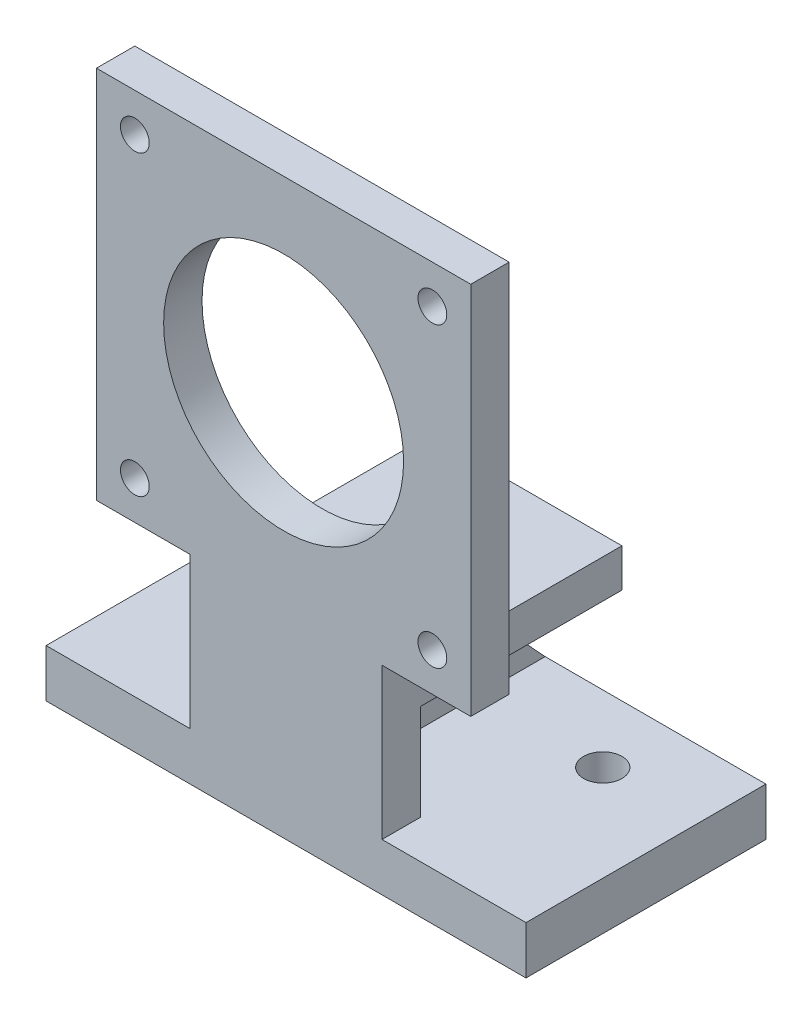
ISO-10303-21;
HEADER;
FILE_DESCRIPTION(('STEP AP214'),'2;1');
FILE_NAME('part.step','',(''),(''),'','','');
FILE_SCHEMA(('AUTOMOTIVE_DESIGN { 1 0 10303 214 1 1 1 1 }'));
ENDSEC;
DATA;
#1=APPLICATION_CONTEXT('core data for automotive mechanical design processes');
#2=APPLICATION_PROTOCOL_DEFINITION('international standard','automotive_design',2000,#1);
#3=PRODUCT_CONTEXT('',#1,'mechanical');
#4=PRODUCT('Part','Part','',(#3));
#5=PRODUCT_RELATED_PRODUCT_CATEGORY('part','',(#4));
#6=PRODUCT_DEFINITION_FORMATION('','',#4);
#7=PRODUCT_DEFINITION_CONTEXT('part definition',#1,'design');
#8=PRODUCT_DEFINITION('design','',#6,#7);
#9=PRODUCT_DEFINITION_SHAPE('','',#8);
#10=(LENGTH_UNIT() NAMED_UNIT(*) SI_UNIT(.MILLI.,.METRE.));
#11=(NAMED_UNIT(*) PLANE_ANGLE_UNIT() SI_UNIT($,.RADIAN.));
#12=(NAMED_UNIT(*) SI_UNIT($,.STERADIAN.) SOLID_ANGLE_UNIT());
#13=UNCERTAINTY_MEASURE_WITH_UNIT(LENGTH_MEASURE(1.E-05),#10,'distance_accuracy_value','');
#14=(GEOMETRIC_REPRESENTATION_CONTEXT(3) GLOBAL_UNCERTAINTY_ASSIGNED_CONTEXT((#13)) GLOBAL_UNIT_ASSIGNED_CONTEXT((#10,
#11,#12)) REPRESENTATION_CONTEXT('',''));
#15=CARTESIAN_POINT('',(0.,0.,0.));
#16=DIRECTION('',(0.,0.,1.));
#17=DIRECTION('',(1.,0.,0.));
#18=AXIS2_PLACEMENT_3D('',#15,#16,#17);
#19=CARTESIAN_POINT('',(0.,0.,0.));
#20=DIRECTION('',(0.,0.,1.));
#21=DIRECTION('',(1.,0.,0.));
#22=AXIS2_PLACEMENT_3D('',#19,#20,#21);
#23=PLANE('',#22);
#24=DIRECTION('',(-1.,0.,0.));
#25=VECTOR('',#24,1.);
#26=CARTESIAN_POINT('',(0.,-25.,0.));
#27=LINE('',#26,#25);
#28=CARTESIAN_POINT('',(10.,-25.,0.));
#29=VERTEX_POINT('',#28);
#30=CARTESIAN_POINT('',(2.,-25.,0.));
#31=VERTEX_POINT('',#30);
#32=EDGE_CURVE('E267',#29,#31,#27,.T.);
#33=ORIENTED_EDGE('',*,*,#32,.F.);
#34=DIRECTION('',(0.,-1.,0.));
#35=VECTOR('',#34,1.);
#36=CARTESIAN_POINT('',(10.,0.,0.));
#37=LINE('',#36,#35);
#38=CARTESIAN_POINT('',(10.,-35.,0.));
#39=VERTEX_POINT('',#38);
#40=EDGE_CURVE('E465',#29,#39,#37,.T.);
#41=ORIENTED_EDGE('',*,*,#40,.T.);
#42=DIRECTION('',(-1.,0.,0.));
#43=VECTOR('',#42,1.);
#44=CARTESIAN_POINT('',(0.,-35.,0.));
#45=LINE('',#44,#43);
#46=CARTESIAN_POINT('',(2.,-35.,0.));
#47=VERTEX_POINT('',#46);
#48=EDGE_CURVE('E393',#39,#47,#45,.T.);
#49=ORIENTED_EDGE('',*,*,#48,.T.);
#50=DIRECTION('',(0.,-1.,0.));
#51=VECTOR('',#50,1.);
#52=CARTESIAN_POINT('',(2.,0.,0.));
#53=LINE('',#52,#51);
#54=EDGE_CURVE('E319',#31,#47,#53,.T.);
#55=ORIENTED_EDGE('',*,*,#54,.F.);
#56=EDGE_LOOP('',(#33,#41,#49,#55));
#57=FACE_BOUND('',#56,.T.);
#58=ADVANCED_FACE('F116',(#57),#23,.F.);
#59=CARTESIAN_POINT('',(-2.,-25.,0.));
#60=VERTEX_POINT('',#59);
#61=CARTESIAN_POINT('',(-9.99999999999999,-25.,0.));
#62=VERTEX_POINT('',#61);
#63=EDGE_CURVE('E272',#60,#62,#27,.T.);
#64=ORIENTED_EDGE('',*,*,#63,.F.);
#65=DIRECTION('',(0.,-1.,0.));
#66=VECTOR('',#65,1.);
#67=CARTESIAN_POINT('',(-2.,0.,0.));
#68=LINE('',#67,#66);
#69=CARTESIAN_POINT('',(-2.,-35.,0.));
#70=VERTEX_POINT('',#69);
#71=EDGE_CURVE('E140',#60,#70,#68,.T.);
#72=ORIENTED_EDGE('',*,*,#71,.T.);
#73=CARTESIAN_POINT('',(-9.99999999999999,-35.,0.));
#74=VERTEX_POINT('',#73);
#75=EDGE_CURVE('E382',#70,#74,#45,.T.);
#76=ORIENTED_EDGE('',*,*,#75,.T.);
#77=DIRECTION('',(0.,-1.,0.));
#78=VECTOR('',#77,1.);
#79=CARTESIAN_POINT('',(-10.,0.,0.));
#80=LINE('',#79,#78);
#81=EDGE_CURVE('E490',#62,#74,#80,.T.);
#82=ORIENTED_EDGE('',*,*,#81,.F.);
#83=EDGE_LOOP('',(#64,#72,#76,#82));
#84=FACE_BOUND('',#83,.T.);
#85=ADVANCED_FACE('F588',(#84),#23,.F.);
#86=CARTESIAN_POINT('',(-0.252287314728645,0.223171224059343,0.));
#87=DIRECTION('',(0.,0.,1.));
#88=DIRECTION('',(1.,0.,0.));
#89=AXIS2_PLACEMENT_3D('',#86,#87,#88);
#90=CIRCLE('',#89,12.5);
#91=CARTESIAN_POINT('',(12.2477126852714,0.223171224059343,0.));
#92=VERTEX_POINT('',#91);
#93=EDGE_CURVE('E400',#92,#92,#90,.T.);
#94=ORIENTED_EDGE('',*,*,#93,.T.);
#95=EDGE_LOOP('',(#94));
#96=FACE_BOUND('',#95,.T.);
#97=CARTESIAN_POINT('',(-15.7522873147283,-15.2768287759407,0.));
#98=DIRECTION('',(0.,0.,1.));
#99=DIRECTION('',(1.,0.,0.));
#100=AXIS2_PLACEMENT_3D('',#97,#98,#99);
#101=CIRCLE('',#100,1.5);
#102=CARTESIAN_POINT('',(-14.2522873147283,-15.2768287759407,0.));
#103=VERTEX_POINT('',#102);
#104=EDGE_CURVE('E405',#103,#103,#101,.T.);
#105=ORIENTED_EDGE('',*,*,#104,.T.);
#106=EDGE_LOOP('',(#105));
#107=FACE_BOUND('',#106,.T.);
#108=CARTESIAN_POINT('',(-15.7522873147286,15.7231712240593,0.));
#109=DIRECTION('',(0.,0.,1.));
#110=DIRECTION('',(1.,0.,0.));
#111=AXIS2_PLACEMENT_3D('',#108,#109,#110);
#112=CIRCLE('',#111,1.5);
#113=CARTESIAN_POINT('',(-14.2522873147286,15.7231712240593,0.));
#114=VERTEX_POINT('',#113);
#115=EDGE_CURVE('E457',#114,#114,#112,.T.);
#116=ORIENTED_EDGE('',*,*,#115,.T.);
#117=EDGE_LOOP('',(#116));
#118=FACE_BOUND('',#117,.T.);
#119=CARTESIAN_POINT('',(15.2477126852717,-15.2768287759407,0.));
#120=DIRECTION('',(0.,0.,1.));
#121=DIRECTION('',(1.,0.,0.));
#122=AXIS2_PLACEMENT_3D('',#119,#120,#121);
#123=CIRCLE('',#122,1.5);
#124=CARTESIAN_POINT('',(16.7477126852717,-15.2768287759407,0.));
#125=VERTEX_POINT('',#124);
#126=EDGE_CURVE('E461',#125,#125,#123,.T.);
#127=ORIENTED_EDGE('',*,*,#126,.T.);
#128=EDGE_LOOP('',(#127));
#129=FACE_BOUND('',#128,.T.);
#130=CARTESIAN_POINT('',(15.2477126852714,15.7231712240593,0.));
#131=DIRECTION('',(0.,0.,1.));
#132=DIRECTION('',(1.,0.,0.));
#133=AXIS2_PLACEMENT_3D('',#130,#131,#132);
#134=CIRCLE('',#133,1.5);
#135=CARTESIAN_POINT('',(16.7477126852714,15.7231712240593,0.));
#136=VERTEX_POINT('',#135);
#137=EDGE_CURVE('E414',#136,#136,#134,.T.);
#138=ORIENTED_EDGE('',*,*,#137,.T.);
#139=EDGE_LOOP('',(#138));
#140=FACE_BOUND('',#139,.T.);
#141=DIRECTION('',(1.,0.,0.));
#142=VECTOR('',#141,1.);
#143=CARTESIAN_POINT('',(-21.,-21.,0.));
#144=LINE('',#143,#142);
#145=CARTESIAN_POINT('',(-9.99999999999999,-21.,0.));
#146=VERTEX_POINT('',#145);
#147=CARTESIAN_POINT('',(10.,-21.,0.));
#148=VERTEX_POINT('',#147);
#149=EDGE_CURVE('E308',#146,#148,#144,.T.);
#150=ORIENTED_EDGE('',*,*,#149,.F.);
#151=CARTESIAN_POINT('',(-9.99999999999999,-19.2768287759407,0.));
#152=VERTEX_POINT('',#151);
#153=EDGE_CURVE('E487',#152,#146,#80,.T.);
#154=ORIENTED_EDGE('',*,*,#153,.F.);
#155=DIRECTION('',(-1.,0.,0.));
#156=VECTOR('',#155,1.);
#157=CARTESIAN_POINT('',(0.,-19.2768287759407,0.));
#158=LINE('',#157,#156);
#159=CARTESIAN_POINT('',(-19.7522873147286,-19.2768287759407,0.));
#160=VERTEX_POINT('',#159);
#161=EDGE_CURVE('E475',#152,#160,#158,.T.);
#162=ORIENTED_EDGE('',*,*,#161,.T.);
#163=DIRECTION('',(0.,-1.,0.));
#164=VECTOR('',#163,1.);
#165=CARTESIAN_POINT('',(-19.7522873147286,0.,0.));
#166=LINE('',#165,#164);
#167=CARTESIAN_POINT('',(-19.7522873147286,19.7231712240593,0.));
#168=VERTEX_POINT('',#167);
#169=EDGE_CURVE('E483',#168,#160,#166,.T.);
#170=ORIENTED_EDGE('',*,*,#169,.F.);
#171=DIRECTION('',(-1.,0.,0.));
#172=VECTOR('',#171,1.);
#173=CARTESIAN_POINT('',(0.,19.7231712240593,0.));
#174=LINE('',#173,#172);
#175=CARTESIAN_POINT('',(19.2477126852714,19.7231712240593,0.));
#176=VERTEX_POINT('',#175);
#177=EDGE_CURVE('E479',#176,#168,#174,.T.);
#178=ORIENTED_EDGE('',*,*,#177,.F.);
#179=DIRECTION('',(0.,-1.,0.));
#180=VECTOR('',#179,1.);
#181=CARTESIAN_POINT('',(19.2477126852714,0.,0.));
#182=LINE('',#181,#180);
#183=CARTESIAN_POINT('',(19.2477126852714,-19.2768287759407,0.));
#184=VERTEX_POINT('',#183);
#185=EDGE_CURVE('E474',#176,#184,#182,.T.);
#186=ORIENTED_EDGE('',*,*,#185,.T.);
#187=CARTESIAN_POINT('',(10.,-19.2768287759407,0.));
#188=VERTEX_POINT('',#187);
#189=EDGE_CURVE('E470',#184,#188,#158,.T.);
#190=ORIENTED_EDGE('',*,*,#189,.T.);
#191=EDGE_CURVE('E466',#188,#148,#37,.T.);
#192=ORIENTED_EDGE('',*,*,#191,.T.);
#193=EDGE_LOOP('',(#150,#154,#162,#170,#178,#186,#190,#192));
#194=FACE_BOUND('',#193,.T.);
#195=ADVANCED_FACE('F573',(#96,#107,#118,#129,#140,#194),#23,.F.);
#196=CARTESIAN_POINT('',(-2.,-5.63619234872219,6.10572395330845));
#197=DIRECTION('',(0.,0.678289165188047,-0.734795079180926));
#198=DIRECTION('',(0.,0.734795079180926,0.678289165188047));
#199=AXIS2_PLACEMENT_3D('',#196,#197,#198);
#200=PLANE('',#199);
#201=DIRECTION('',(0.,0.734795079180926,0.678289165188047));
#202=VECTOR('',#201,1.);
#203=CARTESIAN_POINT('',(-2.,-5.63619234872219,6.10572395330845));
#204=LINE('',#203,#202);
#205=CARTESIAN_POINT('',(-2.,-35.,-21.));
#206=VERTEX_POINT('',#205);
#207=CARTESIAN_POINT('',(-2.,-25.,-11.769002346285));
#208=VERTEX_POINT('',#207);
#209=EDGE_CURVE('E324',#206,#208,#204,.T.);
#210=ORIENTED_EDGE('',*,*,#209,.T.);
#211=DIRECTION('',(1.,0.,0.));
#212=VECTOR('',#211,1.);
#213=CARTESIAN_POINT('',(-2.,-25.,-11.769002346285));
#214=LINE('',#213,#212);
#215=CARTESIAN_POINT('',(2.,-25.,-11.769002346285));
#216=VERTEX_POINT('',#215);
#217=EDGE_CURVE('E276',#208,#216,#214,.T.);
#218=ORIENTED_EDGE('',*,*,#217,.T.);
#219=DIRECTION('',(0.,0.734795079180926,0.678289165188047));
#220=VECTOR('',#219,1.);
#221=CARTESIAN_POINT('',(2.,-5.63619234872219,6.10572395330845));
#222=LINE('',#221,#220);
#223=CARTESIAN_POINT('',(2.,-35.,-21.));
#224=VERTEX_POINT('',#223);
#225=EDGE_CURVE('E315',#224,#216,#222,.T.);
#226=ORIENTED_EDGE('',*,*,#225,.F.);
#227=DIRECTION('',(1.,0.,0.));
#228=VECTOR('',#227,1.);
#229=CARTESIAN_POINT('',(-2.,-35.,-21.));
#230=LINE('',#229,#228);
#231=EDGE_CURVE('E330',#206,#224,#230,.T.);
#232=ORIENTED_EDGE('',*,*,#231,.F.);
#233=EDGE_LOOP('',(#210,#218,#226,#232));
#234=FACE_BOUND('',#233,.T.);
#235=ADVANCED_FACE('F584',(#234),#200,.T.);
#236=CARTESIAN_POINT('',(-2.,0.,0.));
#237=DIRECTION('',(1.,0.,0.));
#238=DIRECTION('',(0.,0.,-1.));
#239=AXIS2_PLACEMENT_3D('',#236,#237,#238);
#240=PLANE('',#239);
#241=DIRECTION('',(0.,0.,1.));
#242=VECTOR('',#241,1.);
#243=CARTESIAN_POINT('',(-2.,-25.,0.));
#244=LINE('',#243,#242);
#245=EDGE_CURVE('E305',#208,#60,#244,.T.);
#246=ORIENTED_EDGE('',*,*,#245,.F.);
#247=ORIENTED_EDGE('',*,*,#209,.F.);
#248=DIRECTION('',(0.,0.,-1.));
#249=VECTOR('',#248,1.);
#250=CARTESIAN_POINT('',(-2.,-35.,0.));
#251=LINE('',#250,#249);
#252=EDGE_CURVE('E132',#70,#206,#251,.T.);
#253=ORIENTED_EDGE('',*,*,#252,.F.);
#254=ORIENTED_EDGE('',*,*,#71,.F.);
#255=EDGE_LOOP('',(#246,#247,#253,#254));
#256=FACE_BOUND('',#255,.T.);
#257=ADVANCED_FACE('F587',(#256),#240,.F.);
#258=CARTESIAN_POINT('',(2.,0.,0.));
#259=DIRECTION('',(1.,0.,0.));
#260=DIRECTION('',(0.,0.,-1.));
#261=AXIS2_PLACEMENT_3D('',#258,#259,#260);
#262=PLANE('',#261);
#263=ORIENTED_EDGE('',*,*,#225,.T.);
#264=DIRECTION('',(0.,0.,1.));
#265=VECTOR('',#264,1.);
#266=CARTESIAN_POINT('',(2.,-25.,0.));
#267=LINE('',#266,#265);
#268=EDGE_CURVE('E12',#216,#31,#267,.T.);
#269=ORIENTED_EDGE('',*,*,#268,.T.);
#270=ORIENTED_EDGE('',*,*,#54,.T.);
#271=DIRECTION('',(0.,0.,-1.));
#272=VECTOR('',#271,1.);
#273=CARTESIAN_POINT('',(2.,-35.,0.));
#274=LINE('',#273,#272);
#275=EDGE_CURVE('E311',#47,#224,#274,.T.);
#276=ORIENTED_EDGE('',*,*,#275,.T.);
#277=EDGE_LOOP('',(#263,#269,#270,#276));
#278=FACE_BOUND('',#277,.T.);
#279=ADVANCED_FACE('F581',(#278),#262,.T.);
#280=CARTESIAN_POINT('',(0.,-35.,0.));
#281=DIRECTION('',(0.,1.,0.));
#282=DIRECTION('',(-1.,0.,0.));
#283=AXIS2_PLACEMENT_3D('',#280,#281,#282);
#284=PLANE('',#283);
#285=CARTESIAN_POINT('',(-15.,-35.,-14.));
#286=DIRECTION('',(0.,-1.,0.));
#287=DIRECTION('',(1.,0.,0.));
#288=AXIS2_PLACEMENT_3D('',#285,#286,#287);
#289=CIRCLE('',#288,2.);
#290=CARTESIAN_POINT('',(-13.,-35.,-14.));
#291=VERTEX_POINT('',#290);
#292=EDGE_CURVE('E342',#291,#291,#289,.T.);
#293=ORIENTED_EDGE('',*,*,#292,.T.);
#294=EDGE_LOOP('',(#293));
#295=FACE_BOUND('',#294,.T.);
#296=ORIENTED_EDGE('',*,*,#75,.F.);
#297=ORIENTED_EDGE('',*,*,#252,.T.);
#298=DIRECTION('',(1.,0.,0.));
#299=VECTOR('',#298,1.);
#300=CARTESIAN_POINT('',(25.,-35.,-21.));
#301=LINE('',#300,#299);
#302=CARTESIAN_POINT('',(-25.,-35.,-21.));
#303=VERTEX_POINT('',#302);
#304=EDGE_CURVE('E365',#303,#206,#301,.T.);
#305=ORIENTED_EDGE('',*,*,#304,.F.);
#306=DIRECTION('',(0.,0.,-1.));
#307=VECTOR('',#306,1.);
#308=CARTESIAN_POINT('',(-25.,-35.,3.99999999999999));
#309=LINE('',#308,#307);
#310=CARTESIAN_POINT('',(-25.,-35.,3.99999999999999));
#311=VERTEX_POINT('',#310);
#312=EDGE_CURVE('E360',#311,#303,#309,.T.);
#313=ORIENTED_EDGE('',*,*,#312,.F.);
#314=DIRECTION('',(-1.,0.,0.));
#315=VECTOR('',#314,1.);
#316=CARTESIAN_POINT('',(25.,-35.,3.99999999999999));
#317=LINE('',#316,#315);
#318=CARTESIAN_POINT('',(-9.99999999999999,-35.,3.99999999999999));
#319=VERTEX_POINT('',#318);
#320=EDGE_CURVE('E354',#319,#311,#317,.T.);
#321=ORIENTED_EDGE('',*,*,#320,.F.);
#322=DIRECTION('',(0.,0.,1.));
#323=VECTOR('',#322,1.);
#324=CARTESIAN_POINT('',(-9.99999999999999,-35.,4.));
#325=LINE('',#324,#323);
#326=EDGE_CURVE('E125',#74,#319,#325,.T.);
#327=ORIENTED_EDGE('',*,*,#326,.F.);
#328=EDGE_LOOP('',(#296,#297,#305,#313,#321,#327));
#329=FACE_BOUND('',#328,.T.);
#330=ADVANCED_FACE('F590',(#295,#329),#284,.T.);
#331=CARTESIAN_POINT('',(0.,0.,4.));
#332=DIRECTION('',(0.,0.,1.));
#333=DIRECTION('',(1.,0.,0.));
#334=AXIS2_PLACEMENT_3D('',#331,#332,#333);
#335=PLANE('',#334);
#336=DIRECTION('',(0.,-1.,0.));
#337=VECTOR('',#336,1.);
#338=CARTESIAN_POINT('',(-10.,0.,4.));
#339=LINE('',#338,#337);
#340=CARTESIAN_POINT('',(-9.99999999999999,-19.2768287759407,4.));
#341=VERTEX_POINT('',#340);
#342=EDGE_CURVE('E442',#341,#319,#339,.T.);
#343=ORIENTED_EDGE('',*,*,#342,.T.);
#344=ORIENTED_EDGE('',*,*,#320,.T.);
#345=DIRECTION('',(0.,-1.,0.));
#346=VECTOR('',#345,1.);
#347=CARTESIAN_POINT('',(-25.,-35.,3.99999999999999));
#348=LINE('',#347,#346);
#349=CARTESIAN_POINT('',(-25.,-40.,3.99999999999999));
#350=VERTEX_POINT('',#349);
#351=EDGE_CURVE('E386',#311,#350,#348,.T.);
#352=ORIENTED_EDGE('',*,*,#351,.T.);
#353=DIRECTION('',(1.,0.,0.));
#354=VECTOR('',#353,1.);
#355=CARTESIAN_POINT('',(0.,-40.,4.));
#356=LINE('',#355,#354);
#357=CARTESIAN_POINT('',(25.,-40.,3.99999999999999));
#358=VERTEX_POINT('',#357);
#359=EDGE_CURVE('E446',#350,#358,#356,.T.);
#360=ORIENTED_EDGE('',*,*,#359,.T.);
#361=DIRECTION('',(0.,-1.,0.));
#362=VECTOR('',#361,1.);
#363=CARTESIAN_POINT('',(25.,-35.,3.99999999999999));
#364=LINE('',#363,#362);
#365=CARTESIAN_POINT('',(25.,-35.,3.99999999999999));
#366=VERTEX_POINT('',#365);
#367=EDGE_CURVE('E368',#366,#358,#364,.T.);
#368=ORIENTED_EDGE('',*,*,#367,.F.);
#369=CARTESIAN_POINT('',(10.,-35.,3.99999999999999));
#370=VERTEX_POINT('',#369);
#371=EDGE_CURVE('E356',#366,#370,#317,.T.);
#372=ORIENTED_EDGE('',*,*,#371,.T.);
#373=DIRECTION('',(0.,-1.,0.));
#374=VECTOR('',#373,1.);
#375=CARTESIAN_POINT('',(10.,0.,4.));
#376=LINE('',#375,#374);
#377=CARTESIAN_POINT('',(10.,-19.2768287759407,4.));
#378=VERTEX_POINT('',#377);
#379=EDGE_CURVE('E422',#378,#370,#376,.T.);
#380=ORIENTED_EDGE('',*,*,#379,.F.);
#381=DIRECTION('',(-1.,0.,0.));
#382=VECTOR('',#381,1.);
#383=CARTESIAN_POINT('',(0.,-19.2768287759407,4.));
#384=LINE('',#383,#382);
#385=CARTESIAN_POINT('',(19.2477126852714,-19.2768287759407,4.));
#386=VERTEX_POINT('',#385);
#387=EDGE_CURVE('E426',#386,#378,#384,.T.);
#388=ORIENTED_EDGE('',*,*,#387,.F.);
#389=DIRECTION('',(0.,-1.,0.));
#390=VECTOR('',#389,1.);
#391=CARTESIAN_POINT('',(19.2477126852714,0.,4.));
#392=LINE('',#391,#390);
#393=CARTESIAN_POINT('',(19.2477126852714,19.7231712240593,4.));
#394=VERTEX_POINT('',#393);
#395=EDGE_CURVE('E430',#394,#386,#392,.T.);
#396=ORIENTED_EDGE('',*,*,#395,.F.);
#397=DIRECTION('',(-1.,0.,0.));
#398=VECTOR('',#397,1.);
#399=CARTESIAN_POINT('',(0.,19.7231712240593,4.));
#400=LINE('',#399,#398);
#401=CARTESIAN_POINT('',(-19.7522873147286,19.7231712240593,4.));
#402=VERTEX_POINT('',#401);
#403=EDGE_CURVE('E435',#394,#402,#400,.T.);
#404=ORIENTED_EDGE('',*,*,#403,.T.);
#405=DIRECTION('',(0.,-1.,0.));
#406=VECTOR('',#405,1.);
#407=CARTESIAN_POINT('',(-19.7522873147286,0.,4.));
#408=LINE('',#407,#406);
#409=CARTESIAN_POINT('',(-19.7522873147286,-19.2768287759407,4.));
#410=VERTEX_POINT('',#409);
#411=EDGE_CURVE('E439',#402,#410,#408,.T.);
#412=ORIENTED_EDGE('',*,*,#411,.T.);
#413=EDGE_CURVE('E431',#341,#410,#384,.T.);
#414=ORIENTED_EDGE('',*,*,#413,.F.);
#415=EDGE_LOOP('',(#343,#344,#352,#360,#368,#372,#380,#388,#396,#404,#412,#414));
#416=FACE_BOUND('',#415,.T.);
#417=CARTESIAN_POINT('',(15.2477126852714,15.7231712240593,4.));
#418=DIRECTION('',(0.,0.,1.));
#419=DIRECTION('',(1.,0.,0.));
#420=AXIS2_PLACEMENT_3D('',#417,#418,#419);
#421=CIRCLE('',#420,1.5);
#422=CARTESIAN_POINT('',(16.7477126852714,15.7231712240593,4.));
#423=VERTEX_POINT('',#422);
#424=EDGE_CURVE('E449',#423,#423,#421,.T.);
#425=ORIENTED_EDGE('',*,*,#424,.F.);
#426=EDGE_LOOP('',(#425));
#427=FACE_BOUND('',#426,.T.);
#428=CARTESIAN_POINT('',(15.2477126852717,-15.2768287759407,4.));
#429=DIRECTION('',(0.,0.,1.));
#430=DIRECTION('',(1.,0.,0.));
#431=AXIS2_PLACEMENT_3D('',#428,#429,#430);
#432=CIRCLE('',#431,1.5);
#433=CARTESIAN_POINT('',(16.7477126852717,-15.2768287759407,4.));
#434=VERTEX_POINT('',#433);
#435=EDGE_CURVE('E418',#434,#434,#432,.T.);
#436=ORIENTED_EDGE('',*,*,#435,.F.);
#437=EDGE_LOOP('',(#436));
#438=FACE_BOUND('',#437,.T.);
#439=CARTESIAN_POINT('',(-15.7522873147286,15.7231712240593,4.));
#440=DIRECTION('',(0.,0.,1.));
#441=DIRECTION('',(1.,0.,0.));
#442=AXIS2_PLACEMENT_3D('',#439,#440,#441);
#443=CIRCLE('',#442,1.5);
#444=CARTESIAN_POINT('',(-14.2522873147286,15.7231712240593,4.));
#445=VERTEX_POINT('',#444);
#446=EDGE_CURVE('E413',#445,#445,#443,.T.);
#447=ORIENTED_EDGE('',*,*,#446,.F.);
#448=EDGE_LOOP('',(#447));
#449=FACE_BOUND('',#448,.T.);
#450=CARTESIAN_POINT('',(-15.7522873147283,-15.2768287759407,4.));
#451=DIRECTION('',(0.,0.,1.));
#452=DIRECTION('',(1.,0.,0.));
#453=AXIS2_PLACEMENT_3D('',#450,#451,#452);
#454=CIRCLE('',#453,1.5);
#455=CARTESIAN_POINT('',(-14.2522873147283,-15.2768287759407,4.));
#456=VERTEX_POINT('',#455);
#457=EDGE_CURVE('E409',#456,#456,#454,.T.);
#458=ORIENTED_EDGE('',*,*,#457,.F.);
#459=EDGE_LOOP('',(#458));
#460=FACE_BOUND('',#459,.T.);
#461=CARTESIAN_POINT('',(-0.252287314728645,0.223171224059343,4.));
#462=DIRECTION('',(0.,0.,1.));
#463=DIRECTION('',(1.,0.,0.));
#464=AXIS2_PLACEMENT_3D('',#461,#462,#463);
#465=CIRCLE('',#464,12.5);
#466=CARTESIAN_POINT('',(12.2477126852714,0.223171224059343,4.));
#467=VERTEX_POINT('',#466);
#468=EDGE_CURVE('E401',#467,#467,#465,.T.);
#469=ORIENTED_EDGE('',*,*,#468,.F.);
#470=EDGE_LOOP('',(#469));
#471=FACE_BOUND('',#470,.T.);
#472=ADVANCED_FACE('F517',(#416,#427,#438,#449,#460,#471),#335,.T.);
#473=CARTESIAN_POINT('',(10.,0.,4.));
#474=DIRECTION('',(1.,0.,0.));
#475=DIRECTION('',(0.,1.,0.));
#476=AXIS2_PLACEMENT_3D('',#473,#474,#475);
#477=PLANE('',#476);
#478=DIRECTION('',(0.,0.,1.));
#479=VECTOR('',#478,1.);
#480=CARTESIAN_POINT('',(10.,-35.,4.));
#481=LINE('',#480,#479);
#482=EDGE_CURVE('E397',#39,#370,#481,.T.);
#483=ORIENTED_EDGE('',*,*,#482,.F.);
#484=ORIENTED_EDGE('',*,*,#40,.F.);
#485=DIRECTION('',(0.,0.,1.));
#486=VECTOR('',#485,1.);
#487=CARTESIAN_POINT('',(10.,-25.,-21.));
#488=LINE('',#487,#486);
#489=CARTESIAN_POINT('',(10.,-25.,-21.));
#490=VERTEX_POINT('',#489);
#491=EDGE_CURVE('E299',#490,#29,#488,.T.);
#492=ORIENTED_EDGE('',*,*,#491,.F.);
#493=DIRECTION('',(0.,-1.,0.));
#494=VECTOR('',#493,1.);
#495=CARTESIAN_POINT('',(10.,0.,-21.));
#496=LINE('',#495,#494);
#497=CARTESIAN_POINT('',(10.,-21.,-21.));
#498=VERTEX_POINT('',#497);
#499=EDGE_CURVE('E263',#498,#490,#496,.T.);
#500=ORIENTED_EDGE('',*,*,#499,.F.);
#501=DIRECTION('',(0.,0.,1.));
#502=VECTOR('',#501,1.);
#503=CARTESIAN_POINT('',(10.,-21.,-21.));
#504=LINE('',#503,#502);
#505=EDGE_CURVE('E295',#498,#148,#504,.T.);
#506=ORIENTED_EDGE('',*,*,#505,.T.);
#507=ORIENTED_EDGE('',*,*,#191,.F.);
#508=DIRECTION('',(0.,0.,-1.));
#509=VECTOR('',#508,1.);
#510=CARTESIAN_POINT('',(10.,-19.2768287759407,4.));
#511=LINE('',#510,#509);
#512=EDGE_CURVE('E509',#378,#188,#511,.T.);
#513=ORIENTED_EDGE('',*,*,#512,.F.);
#514=ORIENTED_EDGE('',*,*,#379,.T.);
#515=EDGE_LOOP('',(#483,#484,#492,#500,#506,#507,#513,#514));
#516=FACE_BOUND('',#515,.T.);
#517=ADVANCED_FACE('F552',(#516),#477,.T.);
#518=CARTESIAN_POINT('',(0.,-19.2768287759407,4.));
#519=DIRECTION('',(0.,-1.,0.));
#520=DIRECTION('',(1.,0.,0.));
#521=AXIS2_PLACEMENT_3D('',#518,#519,#520);
#522=PLANE('',#521);
#523=ORIENTED_EDGE('',*,*,#189,.F.);
#524=DIRECTION('',(0.,0.,-1.));
#525=VECTOR('',#524,1.);
#526=CARTESIAN_POINT('',(19.2477126852714,-19.2768287759407,4.));
#527=LINE('',#526,#525);
#528=EDGE_CURVE('E506',#386,#184,#527,.T.);
#529=ORIENTED_EDGE('',*,*,#528,.F.);
#530=ORIENTED_EDGE('',*,*,#387,.T.);
#531=ORIENTED_EDGE('',*,*,#512,.T.);
#532=EDGE_LOOP('',(#523,#529,#530,#531));
#533=FACE_BOUND('',#532,.T.);
#534=ADVANCED_FACE('F557',(#533),#522,.T.);
#535=CARTESIAN_POINT('',(19.2477126852714,0.,4.));
#536=DIRECTION('',(1.,0.,0.));
#537=DIRECTION('',(0.,0.,-1.));
#538=AXIS2_PLACEMENT_3D('',#535,#536,#537);
#539=PLANE('',#538);
#540=ORIENTED_EDGE('',*,*,#185,.F.);
#541=DIRECTION('',(0.,0.,-1.));
#542=VECTOR('',#541,1.);
#543=CARTESIAN_POINT('',(19.2477126852714,19.7231712240593,4.));
#544=LINE('',#543,#542);
#545=EDGE_CURVE('E503',#394,#176,#544,.T.);
#546=ORIENTED_EDGE('',*,*,#545,.F.);
#547=ORIENTED_EDGE('',*,*,#395,.T.);
#548=ORIENTED_EDGE('',*,*,#528,.T.);
#549=EDGE_LOOP('',(#540,#546,#547,#548));
#550=FACE_BOUND('',#549,.T.);
#551=ADVANCED_FACE('F561',(#550),#539,.T.);
#552=CARTESIAN_POINT('',(0.,19.7231712240593,4.));
#553=DIRECTION('',(0.,-1.,0.));
#554=DIRECTION('',(0.,0.,-1.));
#555=AXIS2_PLACEMENT_3D('',#552,#553,#554);
#556=PLANE('',#555);
#557=ORIENTED_EDGE('',*,*,#177,.T.);
#558=DIRECTION('',(0.,0.,-1.));
#559=VECTOR('',#558,1.);
#560=CARTESIAN_POINT('',(-19.7522873147286,19.7231712240593,4.));
#561=LINE('',#560,#559);
#562=EDGE_CURVE('E499',#402,#168,#561,.T.);
#563=ORIENTED_EDGE('',*,*,#562,.F.);
#564=ORIENTED_EDGE('',*,*,#403,.F.);
#565=ORIENTED_EDGE('',*,*,#545,.T.);
#566=EDGE_LOOP('',(#557,#563,#564,#565));
#567=FACE_BOUND('',#566,.T.);
#568=ADVANCED_FACE('F566',(#567),#556,.F.);
#569=CARTESIAN_POINT('',(-19.7522873147286,0.,4.));
#570=DIRECTION('',(1.,0.,0.));
#571=DIRECTION('',(0.,1.,0.));
#572=AXIS2_PLACEMENT_3D('',#569,#570,#571);
#573=PLANE('',#572);
#574=ORIENTED_EDGE('',*,*,#169,.T.);
#575=DIRECTION('',(0.,0.,-1.));
#576=VECTOR('',#575,1.);
#577=CARTESIAN_POINT('',(-19.7522873147286,-19.2768287759407,4.));
#578=LINE('',#577,#576);
#579=EDGE_CURVE('E496',#410,#160,#578,.T.);
#580=ORIENTED_EDGE('',*,*,#579,.F.);
#581=ORIENTED_EDGE('',*,*,#411,.F.);
#582=ORIENTED_EDGE('',*,*,#562,.T.);
#583=EDGE_LOOP('',(#574,#580,#581,#582));
#584=FACE_BOUND('',#583,.T.);
#585=ADVANCED_FACE('F568',(#584),#573,.F.);
#586=ORIENTED_EDGE('',*,*,#161,.F.);
#587=DIRECTION('',(0.,0.,-1.));
#588=VECTOR('',#587,1.);
#589=CARTESIAN_POINT('',(-9.99999999999999,-19.2768287759407,4.));
#590=LINE('',#589,#588);
#591=EDGE_CURVE('E453',#341,#152,#590,.T.);
#592=ORIENTED_EDGE('',*,*,#591,.F.);
#593=ORIENTED_EDGE('',*,*,#413,.T.);
#594=ORIENTED_EDGE('',*,*,#579,.T.);
#595=EDGE_LOOP('',(#586,#592,#593,#594));
#596=FACE_BOUND('',#595,.T.);
#597=ADVANCED_FACE('F570',(#596),#522,.T.);
#598=CARTESIAN_POINT('',(-10.,0.,4.));
#599=DIRECTION('',(1.,0.,0.));
#600=DIRECTION('',(0.,1.,0.));
#601=AXIS2_PLACEMENT_3D('',#598,#599,#600);
#602=PLANE('',#601);
#603=ORIENTED_EDGE('',*,*,#153,.T.);
#604=DIRECTION('',(0.,0.,1.));
#605=VECTOR('',#604,1.);
#606=CARTESIAN_POINT('',(-9.99999999999999,-21.,-21.));
#607=LINE('',#606,#605);
#608=CARTESIAN_POINT('',(-9.99999999999999,-21.,-21.));
#609=VERTEX_POINT('',#608);
#610=EDGE_CURVE('E277',#609,#146,#607,.T.);
#611=ORIENTED_EDGE('',*,*,#610,.F.);
#612=DIRECTION('',(0.,1.,0.));
#613=VECTOR('',#612,1.);
#614=CARTESIAN_POINT('',(-10.,0.,-21.));
#615=LINE('',#614,#613);
#616=CARTESIAN_POINT('',(-9.99999999999999,-25.,-21.));
#617=VERTEX_POINT('',#616);
#618=EDGE_CURVE('E260',#617,#609,#615,.T.);
#619=ORIENTED_EDGE('',*,*,#618,.F.);
#620=DIRECTION('',(0.,0.,1.));
#621=VECTOR('',#620,1.);
#622=CARTESIAN_POINT('',(-9.99999999999999,-25.,-21.));
#623=LINE('',#622,#621);
#624=EDGE_CURVE('E270',#617,#62,#623,.T.);
#625=ORIENTED_EDGE('',*,*,#624,.T.);
#626=ORIENTED_EDGE('',*,*,#81,.T.);
#627=ORIENTED_EDGE('',*,*,#326,.T.);
#628=ORIENTED_EDGE('',*,*,#342,.F.);
#629=ORIENTED_EDGE('',*,*,#591,.T.);
#630=EDGE_LOOP('',(#603,#611,#619,#625,#626,#627,#628,#629));
#631=FACE_BOUND('',#630,.T.);
#632=ADVANCED_FACE('F280',(#631),#602,.F.);
#633=CARTESIAN_POINT('',(0.,-40.,4.));
#634=DIRECTION('',(0.,1.,0.));
#635=DIRECTION('',(-1.,0.,0.));
#636=AXIS2_PLACEMENT_3D('',#633,#634,#635);
#637=PLANE('',#636);
#638=DIRECTION('',(0.,0.,1.));
#639=VECTOR('',#638,1.);
#640=CARTESIAN_POINT('',(25.,-40.,3.99999999999999));
#641=LINE('',#640,#639);
#642=CARTESIAN_POINT('',(25.,-40.,-21.));
#643=VERTEX_POINT('',#642);
#644=EDGE_CURVE('E346',#643,#358,#641,.T.);
#645=ORIENTED_EDGE('',*,*,#644,.T.);
#646=ORIENTED_EDGE('',*,*,#359,.F.);
#647=DIRECTION('',(0.,0.,-1.));
#648=VECTOR('',#647,1.);
#649=CARTESIAN_POINT('',(-25.,-40.,3.99999999999999));
#650=LINE('',#649,#648);
#651=CARTESIAN_POINT('',(-25.,-40.,-21.));
#652=VERTEX_POINT('',#651);
#653=EDGE_CURVE('E372',#350,#652,#650,.T.);
#654=ORIENTED_EDGE('',*,*,#653,.T.);
#655=DIRECTION('',(1.,0.,0.));
#656=VECTOR('',#655,1.);
#657=CARTESIAN_POINT('',(25.,-40.,-21.));
#658=LINE('',#657,#656);
#659=EDGE_CURVE('E355',#652,#643,#658,.T.);
#660=ORIENTED_EDGE('',*,*,#659,.T.);
#661=EDGE_LOOP('',(#645,#646,#654,#660));
#662=FACE_BOUND('',#661,.T.);
#663=CARTESIAN_POINT('',(15.,-40.,-14.));
#664=DIRECTION('',(0.,-1.,0.));
#665=DIRECTION('',(1.,0.,0.));
#666=AXIS2_PLACEMENT_3D('',#663,#664,#665);
#667=CIRCLE('',#666,2.00000000000001);
#668=CARTESIAN_POINT('',(17.,-40.,-14.));
#669=VERTEX_POINT('',#668);
#670=EDGE_CURVE('E333',#669,#669,#667,.T.);
#671=ORIENTED_EDGE('',*,*,#670,.F.);
#672=EDGE_LOOP('',(#671));
#673=FACE_BOUND('',#672,.T.);
#674=CARTESIAN_POINT('',(-15.,-40.,-14.));
#675=DIRECTION('',(0.,-1.,0.));
#676=DIRECTION('',(1.,0.,0.));
#677=AXIS2_PLACEMENT_3D('',#674,#675,#676);
#678=CIRCLE('',#677,2.);
#679=CARTESIAN_POINT('',(-13.,-40.,-14.));
#680=VERTEX_POINT('',#679);
#681=EDGE_CURVE('E338',#680,#680,#678,.T.);
#682=ORIENTED_EDGE('',*,*,#681,.F.);
#683=EDGE_LOOP('',(#682));
#684=FACE_BOUND('',#683,.T.);
#685=ADVANCED_FACE('F640',(#662,#673,#684),#637,.F.);
#686=CARTESIAN_POINT('',(15.2477126852717,-15.2768287759407,4.));
#687=DIRECTION('',(0.,0.,-1.));
#688=DIRECTION('',(-1.,0.,0.));
#689=AXIS2_PLACEMENT_3D('',#686,#687,#688);
#690=CYLINDRICAL_SURFACE('',#689,1.5);
#691=ORIENTED_EDGE('',*,*,#435,.T.);
#692=EDGE_LOOP('',(#691));
#693=FACE_BOUND('',#692,.T.);
#694=ORIENTED_EDGE('',*,*,#126,.F.);
#695=EDGE_LOOP('',(#694));
#696=FACE_BOUND('',#695,.T.);
#697=ADVANCED_FACE('F643',(#693,#696),#690,.F.);
#698=CARTESIAN_POINT('',(-15.7522873147286,15.7231712240593,4.));
#699=DIRECTION('',(0.,0.,-1.));
#700=DIRECTION('',(-1.,0.,0.));
#701=AXIS2_PLACEMENT_3D('',#698,#699,#700);
#702=CYLINDRICAL_SURFACE('',#701,1.5);
#703=ORIENTED_EDGE('',*,*,#446,.T.);
#704=EDGE_LOOP('',(#703));
#705=FACE_BOUND('',#704,.T.);
#706=ORIENTED_EDGE('',*,*,#115,.F.);
#707=EDGE_LOOP('',(#706));
#708=FACE_BOUND('',#707,.T.);
#709=ADVANCED_FACE('F637',(#705,#708),#702,.F.);
#710=CARTESIAN_POINT('',(-15.7522873147283,-15.2768287759407,4.));
#711=DIRECTION('',(0.,0.,-1.));
#712=DIRECTION('',(-1.,0.,0.));
#713=AXIS2_PLACEMENT_3D('',#710,#711,#712);
#714=CYLINDRICAL_SURFACE('',#713,1.5);
#715=ORIENTED_EDGE('',*,*,#457,.T.);
#716=EDGE_LOOP('',(#715));
#717=FACE_BOUND('',#716,.T.);
#718=ORIENTED_EDGE('',*,*,#104,.F.);
#719=EDGE_LOOP('',(#718));
#720=FACE_BOUND('',#719,.T.);
#721=ADVANCED_FACE('F118',(#717,#720),#714,.F.);
#722=CARTESIAN_POINT('',(15.2477126852714,15.7231712240593,4.));
#723=DIRECTION('',(0.,0.,-1.));
#724=DIRECTION('',(-1.,0.,0.));
#725=AXIS2_PLACEMENT_3D('',#722,#723,#724);
#726=CYLINDRICAL_SURFACE('',#725,1.5);
#727=ORIENTED_EDGE('',*,*,#424,.T.);
#728=EDGE_LOOP('',(#727));
#729=FACE_BOUND('',#728,.T.);
#730=ORIENTED_EDGE('',*,*,#137,.F.);
#731=EDGE_LOOP('',(#730));
#732=FACE_BOUND('',#731,.T.);
#733=ADVANCED_FACE('F627',(#729,#732),#726,.F.);
#734=CARTESIAN_POINT('',(-0.252287314728645,0.223171224059343,4.));
#735=DIRECTION('',(0.,0.,-1.));
#736=DIRECTION('',(-1.,0.,0.));
#737=AXIS2_PLACEMENT_3D('',#734,#735,#736);
#738=CYLINDRICAL_SURFACE('',#737,12.5);
#739=ORIENTED_EDGE('',*,*,#468,.T.);
#740=EDGE_LOOP('',(#739));
#741=FACE_BOUND('',#740,.T.);
#742=ORIENTED_EDGE('',*,*,#93,.F.);
#743=EDGE_LOOP('',(#742));
#744=FACE_BOUND('',#743,.T.);
#745=ADVANCED_FACE('F629',(#741,#744),#738,.F.);
#746=CARTESIAN_POINT('',(25.,-35.,3.99999999999999));
#747=DIRECTION('',(1.,0.,0.));
#748=DIRECTION('',(0.,0.,-1.));
#749=AXIS2_PLACEMENT_3D('',#746,#747,#748);
#750=PLANE('',#749);
#751=ORIENTED_EDGE('',*,*,#644,.F.);
#752=DIRECTION('',(0.,-1.,0.));
#753=VECTOR('',#752,1.);
#754=CARTESIAN_POINT('',(25.,-35.,-21.));
#755=LINE('',#754,#753);
#756=CARTESIAN_POINT('',(25.,-35.,-21.));
#757=VERTEX_POINT('',#756);
#758=EDGE_CURVE('E379',#757,#643,#755,.T.);
#759=ORIENTED_EDGE('',*,*,#758,.F.);
#760=DIRECTION('',(0.,0.,1.));
#761=VECTOR('',#760,1.);
#762=CARTESIAN_POINT('',(25.,-35.,3.99999999999999));
#763=LINE('',#762,#761);
#764=EDGE_CURVE('E350',#757,#366,#763,.T.);
#765=ORIENTED_EDGE('',*,*,#764,.T.);
#766=ORIENTED_EDGE('',*,*,#367,.T.);
#767=EDGE_LOOP('',(#751,#759,#765,#766));
#768=FACE_BOUND('',#767,.T.);
#769=ADVANCED_FACE('F543',(#768),#750,.T.);
#770=CARTESIAN_POINT('',(25.,-35.,-21.));
#771=DIRECTION('',(0.,0.,-1.));
#772=DIRECTION('',(-1.,0.,0.));
#773=AXIS2_PLACEMENT_3D('',#770,#771,#772);
#774=PLANE('',#773);
#775=ORIENTED_EDGE('',*,*,#659,.F.);
#776=DIRECTION('',(0.,-1.,0.));
#777=VECTOR('',#776,1.);
#778=CARTESIAN_POINT('',(-25.,-35.,-21.));
#779=LINE('',#778,#777);
#780=EDGE_CURVE('E383',#303,#652,#779,.T.);
#781=ORIENTED_EDGE('',*,*,#780,.F.);
#782=ORIENTED_EDGE('',*,*,#304,.T.);
#783=ORIENTED_EDGE('',*,*,#231,.T.);
#784=EDGE_CURVE('E364',#224,#757,#301,.T.);
#785=ORIENTED_EDGE('',*,*,#784,.T.);
#786=ORIENTED_EDGE('',*,*,#758,.T.);
#787=EDGE_LOOP('',(#775,#781,#782,#783,#785,#786));
#788=FACE_BOUND('',#787,.T.);
#789=ADVANCED_FACE('F535',(#788),#774,.T.);
#790=CARTESIAN_POINT('',(-25.,-35.,3.99999999999999));
#791=DIRECTION('',(-1.,0.,0.));
#792=DIRECTION('',(0.,-1.,0.));
#793=AXIS2_PLACEMENT_3D('',#790,#791,#792);
#794=PLANE('',#793);
#795=ORIENTED_EDGE('',*,*,#653,.F.);
#796=ORIENTED_EDGE('',*,*,#351,.F.);
#797=ORIENTED_EDGE('',*,*,#312,.T.);
#798=ORIENTED_EDGE('',*,*,#780,.T.);
#799=EDGE_LOOP('',(#795,#796,#797,#798));
#800=FACE_BOUND('',#799,.T.);
#801=ADVANCED_FACE('F604',(#800),#794,.T.);
#802=ORIENTED_EDGE('',*,*,#275,.F.);
#803=ORIENTED_EDGE('',*,*,#48,.F.);
#804=ORIENTED_EDGE('',*,*,#482,.T.);
#805=ORIENTED_EDGE('',*,*,#371,.F.);
#806=ORIENTED_EDGE('',*,*,#764,.F.);
#807=ORIENTED_EDGE('',*,*,#784,.F.);
#808=EDGE_LOOP('',(#802,#803,#804,#805,#806,#807));
#809=FACE_BOUND('',#808,.T.);
#810=CARTESIAN_POINT('',(15.,-35.,-14.));
#811=DIRECTION('',(0.,-1.,0.));
#812=DIRECTION('',(1.,0.,0.));
#813=AXIS2_PLACEMENT_3D('',#810,#811,#812);
#814=CIRCLE('',#813,2.00000000000001);
#815=CARTESIAN_POINT('',(17.,-35.,-14.));
#816=VERTEX_POINT('',#815);
#817=EDGE_CURVE('E334',#816,#816,#814,.T.);
#818=ORIENTED_EDGE('',*,*,#817,.T.);
#819=EDGE_LOOP('',(#818));
#820=FACE_BOUND('',#819,.T.);
#821=ADVANCED_FACE('F545',(#809,#820),#284,.T.);
#822=CARTESIAN_POINT('',(-15.,-35.,-14.));
#823=DIRECTION('',(0.,-1.,0.));
#824=DIRECTION('',(1.,0.,0.));
#825=AXIS2_PLACEMENT_3D('',#822,#823,#824);
#826=CYLINDRICAL_SURFACE('',#825,2.);
#827=ORIENTED_EDGE('',*,*,#292,.F.);
#828=EDGE_LOOP('',(#827));
#829=FACE_BOUND('',#828,.T.);
#830=ORIENTED_EDGE('',*,*,#681,.T.);
#831=EDGE_LOOP('',(#830));
#832=FACE_BOUND('',#831,.T.);
#833=ADVANCED_FACE('F603',(#829,#832),#826,.F.);
#834=CARTESIAN_POINT('',(15.,-35.,-14.));
#835=DIRECTION('',(0.,-1.,0.));
#836=DIRECTION('',(1.,0.,0.));
#837=AXIS2_PLACEMENT_3D('',#834,#835,#836);
#838=CYLINDRICAL_SURFACE('',#837,2.00000000000001);
#839=ORIENTED_EDGE('',*,*,#817,.F.);
#840=EDGE_LOOP('',(#839));
#841=FACE_BOUND('',#840,.T.);
#842=ORIENTED_EDGE('',*,*,#670,.T.);
#843=EDGE_LOOP('',(#842));
#844=FACE_BOUND('',#843,.T.);
#845=ADVANCED_FACE('F726',(#841,#844),#838,.F.);
#846=CARTESIAN_POINT('',(-21.,-21.,-21.));
#847=DIRECTION('',(0.,-1.,0.));
#848=DIRECTION('',(1.,0.,0.));
#849=AXIS2_PLACEMENT_3D('',#846,#847,#848);
#850=PLANE('',#849);
#851=ORIENTED_EDGE('',*,*,#149,.T.);
#852=ORIENTED_EDGE('',*,*,#505,.F.);
#853=DIRECTION('',(1.,0.,0.));
#854=VECTOR('',#853,1.);
#855=CARTESIAN_POINT('',(0.,-21.,-21.));
#856=LINE('',#855,#854);
#857=EDGE_CURVE('E284',#609,#498,#856,.T.);
#858=ORIENTED_EDGE('',*,*,#857,.F.);
#859=ORIENTED_EDGE('',*,*,#610,.T.);
#860=EDGE_LOOP('',(#851,#852,#858,#859));
#861=FACE_BOUND('',#860,.T.);
#862=ADVANCED_FACE('F576',(#861),#850,.F.);
#863=CARTESIAN_POINT('',(0.,-25.,-21.));
#864=DIRECTION('',(0.,1.,0.));
#865=DIRECTION('',(0.,0.,1.));
#866=AXIS2_PLACEMENT_3D('',#863,#864,#865);
#867=PLANE('',#866);
#868=ORIENTED_EDGE('',*,*,#217,.F.);
#869=ORIENTED_EDGE('',*,*,#245,.T.);
#870=ORIENTED_EDGE('',*,*,#63,.T.);
#871=ORIENTED_EDGE('',*,*,#624,.F.);
#872=DIRECTION('',(-1.,0.,0.));
#873=VECTOR('',#872,1.);
#874=CARTESIAN_POINT('',(0.,-25.,-21.));
#875=LINE('',#874,#873);
#876=EDGE_CURVE('E256',#490,#617,#875,.T.);
#877=ORIENTED_EDGE('',*,*,#876,.F.);
#878=ORIENTED_EDGE('',*,*,#491,.T.);
#879=ORIENTED_EDGE('',*,*,#32,.T.);
#880=ORIENTED_EDGE('',*,*,#268,.F.);
#881=EDGE_LOOP('',(#868,#869,#870,#871,#877,#878,#879,#880));
#882=FACE_BOUND('',#881,.T.);
#883=ADVANCED_FACE('F271',(#882),#867,.F.);
#884=CARTESIAN_POINT('',(0.,0.,-21.));
#885=DIRECTION('',(0.,0.,-1.));
#886=DIRECTION('',(-1.,0.,0.));
#887=AXIS2_PLACEMENT_3D('',#884,#885,#886);
#888=PLANE('',#887);
#889=ORIENTED_EDGE('',*,*,#857,.T.);
#890=ORIENTED_EDGE('',*,*,#499,.T.);
#891=ORIENTED_EDGE('',*,*,#876,.T.);
#892=ORIENTED_EDGE('',*,*,#618,.T.);
#893=EDGE_LOOP('',(#889,#890,#891,#892));
#894=FACE_BOUND('',#893,.T.);
#895=ADVANCED_FACE('F258',(#894),#888,.T.);
#896=CLOSED_SHELL('',(#58,#85,#195,#235,#257,#279,#330,#472,#517,#534,#551,#568,#585,#597,#632,
#685,#697,#709,#721,#733,#745,#769,#789,#801,#821,#833,#845,#862,#883,#895));
#897=MANIFOLD_SOLID_BREP('B2',#896);
#898=ADVANCED_BREP_SHAPE_REPRESENTATION('',(#18,#897),#14);
#899=SHAPE_DEFINITION_REPRESENTATION(#9,#898);
ENDSEC;
END-ISO-10303-21;
